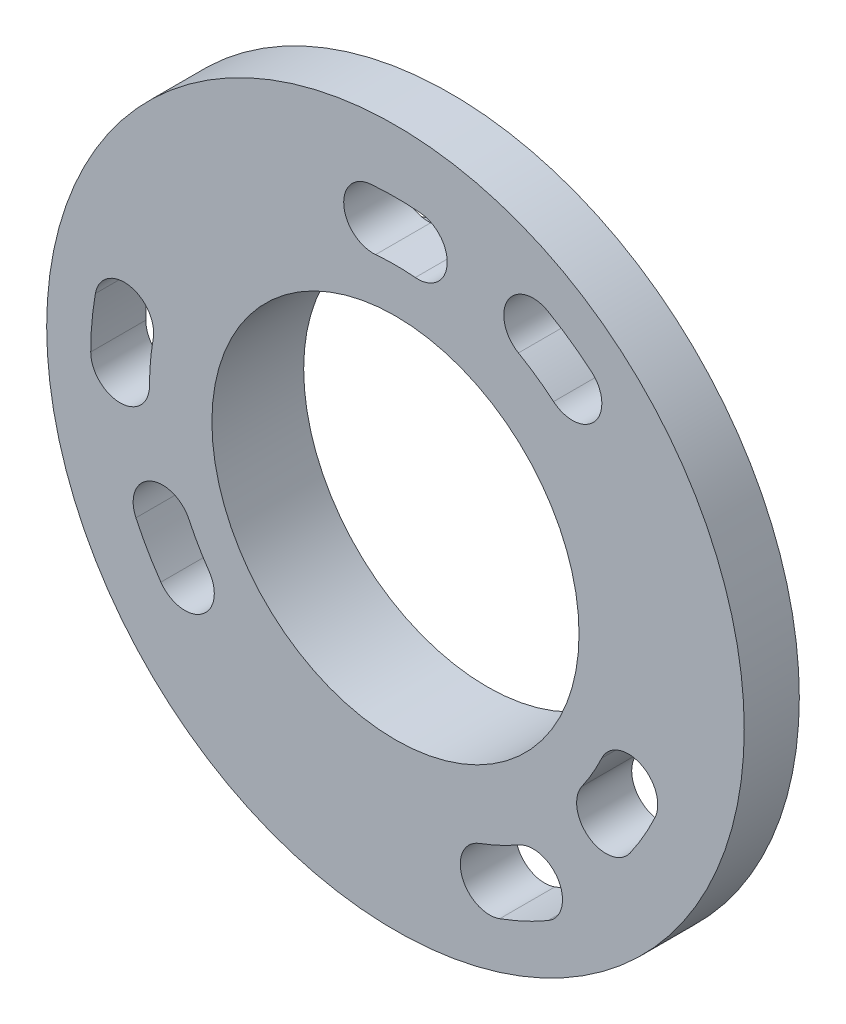
ISO-10303-21;
HEADER;
FILE_DESCRIPTION(('STEP AP214'),'2;1');
FILE_NAME('part.step','',(''),(''),'','','');
FILE_SCHEMA(('AUTOMOTIVE_DESIGN { 1 0 10303 214 1 1 1 1 }'));
ENDSEC;
DATA;
#1=APPLICATION_CONTEXT('core data for automotive mechanical design processes');
#2=APPLICATION_PROTOCOL_DEFINITION('international standard','automotive_design',2000,#1);
#3=PRODUCT_CONTEXT('',#1,'mechanical');
#4=PRODUCT('Part','Part','',(#3));
#5=PRODUCT_RELATED_PRODUCT_CATEGORY('part','',(#4));
#6=PRODUCT_DEFINITION_FORMATION('','',#4);
#7=PRODUCT_DEFINITION_CONTEXT('part definition',#1,'design');
#8=PRODUCT_DEFINITION('design','',#6,#7);
#9=PRODUCT_DEFINITION_SHAPE('','',#8);
#10=(LENGTH_UNIT() NAMED_UNIT(*) SI_UNIT(.MILLI.,.METRE.));
#11=(NAMED_UNIT(*) PLANE_ANGLE_UNIT() SI_UNIT($,.RADIAN.));
#12=(NAMED_UNIT(*) SI_UNIT($,.STERADIAN.) SOLID_ANGLE_UNIT());
#13=UNCERTAINTY_MEASURE_WITH_UNIT(LENGTH_MEASURE(1.E-05),#10,'distance_accuracy_value','');
#14=(GEOMETRIC_REPRESENTATION_CONTEXT(3) GLOBAL_UNCERTAINTY_ASSIGNED_CONTEXT((#13)) GLOBAL_UNIT_ASSIGNED_CONTEXT((#10,
#11,#12)) REPRESENTATION_CONTEXT('',''));
#15=CARTESIAN_POINT('',(0.,0.,0.));
#16=DIRECTION('',(0.,0.,1.));
#17=DIRECTION('',(1.,0.,0.));
#18=AXIS2_PLACEMENT_3D('',#15,#16,#17);
#19=CARTESIAN_POINT('',(0.,0.,0.));
#20=DIRECTION('',(0.,0.,1.));
#21=DIRECTION('',(1.,0.,0.));
#22=AXIS2_PLACEMENT_3D('',#19,#20,#21);
#23=PLANE('',#22);
#24=CARTESIAN_POINT('',(-14.7721162951831,2.60472266500391,0.));
#25=DIRECTION('',(0.,0.,1.));
#26=DIRECTION('',(1.,0.,0.));
#27=AXIS2_PLACEMENT_3D('',#24,#25,#26);
#28=CIRCLE('',#27,1.6);
#29=CARTESIAN_POINT('',(-13.1964238903636,2.32688558073683,0.));
#30=VERTEX_POINT('',#29);
#31=CARTESIAN_POINT('',(-16.3478087000027,2.88255974927099,0.));
#32=VERTEX_POINT('',#31);
#33=EDGE_CURVE('E69',#30,#32,#28,.T.);
#34=ORIENTED_EDGE('',*,*,#33,.T.);
#35=CARTESIAN_POINT('',(0.,0.,0.));
#36=DIRECTION('',(0.,0.,1.));
#37=DIRECTION('',(1.,0.,0.));
#38=AXIS2_PLACEMENT_3D('',#35,#36,#37);
#39=CIRCLE('',#38,16.6);
#40=CARTESIAN_POINT('',(-16.6,1.64214293123828E-13,0.));
#41=VERTEX_POINT('',#40);
#42=EDGE_CURVE('E223',#32,#41,#39,.T.);
#43=ORIENTED_EDGE('',*,*,#42,.T.);
#44=CARTESIAN_POINT('',(-15.,1.52655665885959E-13,0.));
#45=DIRECTION('',(0.,0.,1.));
#46=DIRECTION('',(1.,0.,0.));
#47=AXIS2_PLACEMENT_3D('',#44,#45,#46);
#48=CIRCLE('',#47,1.6);
#49=CARTESIAN_POINT('',(-13.4,1.52655665885959E-13,0.));
#50=VERTEX_POINT('',#49);
#51=EDGE_CURVE('E245',#41,#50,#48,.T.);
#52=ORIENTED_EDGE('',*,*,#51,.T.);
#53=CARTESIAN_POINT('',(0.,0.,0.));
#54=DIRECTION('',(0.,0.,-1.));
#55=DIRECTION('',(1.,0.,0.));
#56=AXIS2_PLACEMENT_3D('',#53,#54,#55);
#57=CIRCLE('',#56,13.4);
#58=EDGE_CURVE('E217',#50,#30,#57,.T.);
#59=ORIENTED_EDGE('',*,*,#58,.T.);
#60=EDGE_LOOP('',(#34,#43,#52,#59));
#61=FACE_BOUND('',#60,.T.);
#62=CARTESIAN_POINT('',(5.13030214988514,-14.0953893117886,0.));
#63=DIRECTION('',(0.,0.,1.));
#64=DIRECTION('',(1.,0.,0.));
#65=AXIS2_PLACEMENT_3D('',#62,#63,#64);
#66=CIRCLE('',#65,1.6);
#67=CARTESIAN_POINT('',(4.58306992056406,-12.5918811185311,0.));
#68=VERTEX_POINT('',#67);
#69=CARTESIAN_POINT('',(5.67753437920622,-15.598897505046,0.));
#70=VERTEX_POINT('',#69);
#71=EDGE_CURVE('E300',#68,#70,#66,.T.);
#72=ORIENTED_EDGE('',*,*,#71,.T.);
#73=CARTESIAN_POINT('',(0.,0.,0.));
#74=DIRECTION('',(0.,0.,1.));
#75=DIRECTION('',(1.,0.,0.));
#76=AXIS2_PLACEMENT_3D('',#73,#74,#75);
#77=CIRCLE('',#76,16.6);
#78=CARTESIAN_POINT('',(8.29999999999991,-14.3760217028217,0.));
#79=VERTEX_POINT('',#78);
#80=EDGE_CURVE('E319',#70,#79,#77,.T.);
#81=ORIENTED_EDGE('',*,*,#80,.T.);
#82=CARTESIAN_POINT('',(7.49999999999993,-12.9903810567666,0.));
#83=DIRECTION('',(0.,0.,1.));
#84=DIRECTION('',(1.,0.,0.));
#85=AXIS2_PLACEMENT_3D('',#82,#83,#84);
#86=CIRCLE('',#85,1.6);
#87=CARTESIAN_POINT('',(6.69999999999994,-11.6047404107115,0.));
#88=VERTEX_POINT('',#87);
#89=EDGE_CURVE('E323',#79,#88,#86,.T.);
#90=ORIENTED_EDGE('',*,*,#89,.T.);
#91=CARTESIAN_POINT('',(0.,0.,0.));
#92=DIRECTION('',(0.,0.,-1.));
#93=DIRECTION('',(1.,0.,0.));
#94=AXIS2_PLACEMENT_3D('',#91,#92,#93);
#95=CIRCLE('',#94,13.4);
#96=EDGE_CURVE('E305',#88,#68,#95,.T.);
#97=ORIENTED_EDGE('',*,*,#96,.T.);
#98=EDGE_LOOP('',(#72,#81,#90,#97));
#99=FACE_BOUND('',#98,.T.);
#100=CARTESIAN_POINT('',(9.64181414529794,11.4906666467848,0.));
#101=DIRECTION('',(0.,0.,1.));
#102=DIRECTION('',(1.,0.,0.));
#103=AXIS2_PLACEMENT_3D('',#100,#101,#102);
#104=CIRCLE('',#103,1.6);
#105=CARTESIAN_POINT('',(8.6133539697995,10.2649955377944,0.));
#106=VERTEX_POINT('',#105);
#107=CARTESIAN_POINT('',(10.6702743207964,12.7163377557752,0.));
#108=VERTEX_POINT('',#107);
#109=EDGE_CURVE('E386',#106,#108,#104,.T.);
#110=ORIENTED_EDGE('',*,*,#109,.T.);
#111=CARTESIAN_POINT('',(0.,0.,0.));
#112=DIRECTION('',(0.,0.,1.));
#113=DIRECTION('',(1.,0.,0.));
#114=AXIS2_PLACEMENT_3D('',#111,#112,#113);
#115=CIRCLE('',#114,16.6);
#116=CARTESIAN_POINT('',(8.30000000000001,14.3760217028217,0.));
#117=VERTEX_POINT('',#116);
#118=EDGE_CURVE('E405',#108,#117,#115,.T.);
#119=ORIENTED_EDGE('',*,*,#118,.T.);
#120=CARTESIAN_POINT('',(7.50000000000001,12.9903810567666,0.));
#121=DIRECTION('',(0.,0.,1.));
#122=DIRECTION('',(1.,0.,0.));
#123=AXIS2_PLACEMENT_3D('',#120,#121,#122);
#124=CIRCLE('',#123,1.6);
#125=CARTESIAN_POINT('',(6.70000000000001,11.6047404107115,0.));
#126=VERTEX_POINT('',#125);
#127=EDGE_CURVE('E409',#117,#126,#124,.T.);
#128=ORIENTED_EDGE('',*,*,#127,.T.);
#129=CARTESIAN_POINT('',(0.,0.,0.));
#130=DIRECTION('',(0.,0.,-1.));
#131=DIRECTION('',(1.,0.,0.));
#132=AXIS2_PLACEMENT_3D('',#129,#130,#131);
#133=CIRCLE('',#132,13.4);
#134=EDGE_CURVE('E391',#126,#106,#133,.T.);
#135=ORIENTED_EDGE('',*,*,#134,.T.);
#136=EDGE_LOOP('',(#110,#119,#128,#135));
#137=FACE_BOUND('',#136,.T.);
#138=CARTESIAN_POINT('',(0.,0.,0.));
#139=DIRECTION('',(0.,0.,1.));
#140=DIRECTION('',(1.,0.,0.));
#141=AXIS2_PLACEMENT_3D('',#138,#139,#140);
#142=CIRCLE('',#141,19.);
#143=CARTESIAN_POINT('',(19.,0.,0.));
#144=VERTEX_POINT('',#143);
#145=EDGE_CURVE('E476',#144,#144,#142,.T.);
#146=ORIENTED_EDGE('',*,*,#145,.F.);
#147=EDGE_LOOP('',(#146));
#148=FACE_BOUND('',#147,.T.);
#149=CARTESIAN_POINT('',(1.22018039846712,13.9467257732844,0.));
#150=DIRECTION('',(0.,0.,1.));
#151=DIRECTION('',(1.,0.,0.));
#152=AXIS2_PLACEMENT_3D('',#149,#150,#151);
#153=CIRCLE('',#152,1.6);
#154=CARTESIAN_POINT('',(1.08073121007088,12.3528142563377,0.));
#155=VERTEX_POINT('',#154);
#156=CARTESIAN_POINT('',(1.35962958686336,15.5406372902312,0.));
#157=VERTEX_POINT('',#156);
#158=EDGE_CURVE('E429',#155,#157,#153,.T.);
#159=ORIENTED_EDGE('',*,*,#158,.T.);
#160=CARTESIAN_POINT('',(0.,0.,0.));
#161=DIRECTION('',(0.,0.,1.));
#162=DIRECTION('',(1.,0.,0.));
#163=AXIS2_PLACEMENT_3D('',#160,#161,#162);
#164=CIRCLE('',#163,15.6);
#165=CARTESIAN_POINT('',(-1.35962958686347,15.5406372902312,0.));
#166=VERTEX_POINT('',#165);
#167=EDGE_CURVE('E448',#157,#166,#164,.T.);
#168=ORIENTED_EDGE('',*,*,#167,.T.);
#169=CARTESIAN_POINT('',(-1.22018039846722,13.9467257732844,0.));
#170=DIRECTION('',(0.,0.,1.));
#171=DIRECTION('',(1.,0.,0.));
#172=AXIS2_PLACEMENT_3D('',#169,#170,#171);
#173=CIRCLE('',#172,1.6);
#174=CARTESIAN_POINT('',(-1.08073121007096,12.3528142563376,0.));
#175=VERTEX_POINT('',#174);
#176=EDGE_CURVE('E452',#166,#175,#173,.T.);
#177=ORIENTED_EDGE('',*,*,#176,.T.);
#178=CARTESIAN_POINT('',(0.,0.,0.));
#179=DIRECTION('',(0.,0.,-1.));
#180=DIRECTION('',(1.,0.,0.));
#181=AXIS2_PLACEMENT_3D('',#178,#179,#180);
#182=CIRCLE('',#181,12.4);
#183=EDGE_CURVE('E434',#175,#155,#182,.T.);
#184=ORIENTED_EDGE('',*,*,#183,.T.);
#185=EDGE_LOOP('',(#159,#168,#177,#184));
#186=FACE_BOUND('',#185,.T.);
#187=CARTESIAN_POINT('',(11.4681286200459,-8.03007010891462,0.));
#188=DIRECTION('',(0.,0.,1.));
#189=DIRECTION('',(1.,0.,0.));
#190=AXIS2_PLACEMENT_3D('',#187,#188,#189);
#191=CIRCLE('',#190,1.6);
#192=CARTESIAN_POINT('',(10.1574853491835,-7.11234781075295,0.));
#193=VERTEX_POINT('',#192);
#194=CARTESIAN_POINT('',(12.7787718909083,-8.94779240707629,0.));
#195=VERTEX_POINT('',#194);
#196=EDGE_CURVE('E343',#193,#195,#191,.T.);
#197=ORIENTED_EDGE('',*,*,#196,.T.);
#198=CARTESIAN_POINT('',(0.,0.,0.));
#199=DIRECTION('',(0.,0.,1.));
#200=DIRECTION('',(1.,0.,0.));
#201=AXIS2_PLACEMENT_3D('',#198,#199,#200);
#202=CIRCLE('',#201,15.6);
#203=CARTESIAN_POINT('',(14.1384014777717,-6.59284488315499,0.));
#204=VERTEX_POINT('',#203);
#205=EDGE_CURVE('E362',#195,#204,#202,.T.);
#206=ORIENTED_EDGE('',*,*,#205,.T.);
#207=CARTESIAN_POINT('',(12.6883090185131,-5.91665566436985,0.));
#208=DIRECTION('',(0.,0.,1.));
#209=DIRECTION('',(1.,0.,0.));
#210=AXIS2_PLACEMENT_3D('',#207,#208,#209);
#211=CIRCLE('',#210,1.6);
#212=CARTESIAN_POINT('',(11.2382165592544,-5.24046644558472,0.));
#213=VERTEX_POINT('',#212);
#214=EDGE_CURVE('E366',#204,#213,#211,.T.);
#215=ORIENTED_EDGE('',*,*,#214,.T.);
#216=CARTESIAN_POINT('',(0.,0.,0.));
#217=DIRECTION('',(0.,0.,-1.));
#218=DIRECTION('',(1.,0.,0.));
#219=AXIS2_PLACEMENT_3D('',#216,#217,#218);
#220=CIRCLE('',#219,12.4);
#221=EDGE_CURVE('E348',#213,#193,#220,.T.);
#222=ORIENTED_EDGE('',*,*,#221,.T.);
#223=EDGE_LOOP('',(#197,#206,#215,#222));
#224=FACE_BOUND('',#223,.T.);
#225=CARTESIAN_POINT('',(-12.6883090185131,-5.91665566436976,0.));
#226=DIRECTION('',(0.,0.,1.));
#227=DIRECTION('',(1.,0.,0.));
#228=AXIS2_PLACEMENT_3D('',#225,#226,#227);
#229=CIRCLE('',#228,1.6);
#230=CARTESIAN_POINT('',(-11.2382165592545,-5.24046644558464,0.));
#231=VERTEX_POINT('',#230);
#232=CARTESIAN_POINT('',(-14.1384014777718,-6.59284488315487,0.));
#233=VERTEX_POINT('',#232);
#234=EDGE_CURVE('E225',#231,#233,#229,.T.);
#235=ORIENTED_EDGE('',*,*,#234,.T.);
#236=CARTESIAN_POINT('',(0.,0.,0.));
#237=DIRECTION('',(0.,0.,1.));
#238=DIRECTION('',(1.,0.,0.));
#239=AXIS2_PLACEMENT_3D('',#236,#237,#238);
#240=CIRCLE('',#239,15.6);
#241=CARTESIAN_POINT('',(-12.7787718909084,-8.9477924070762,0.));
#242=VERTEX_POINT('',#241);
#243=EDGE_CURVE('E276',#233,#242,#240,.T.);
#244=ORIENTED_EDGE('',*,*,#243,.T.);
#245=CARTESIAN_POINT('',(-11.468128620046,-8.03007010891454,0.));
#246=DIRECTION('',(0.,0.,1.));
#247=DIRECTION('',(1.,0.,0.));
#248=AXIS2_PLACEMENT_3D('',#245,#246,#247);
#249=CIRCLE('',#248,1.6);
#250=CARTESIAN_POINT('',(-10.1574853491836,-7.11234781075288,0.));
#251=VERTEX_POINT('',#250);
#252=EDGE_CURVE('E280',#242,#251,#249,.T.);
#253=ORIENTED_EDGE('',*,*,#252,.T.);
#254=CARTESIAN_POINT('',(0.,0.,0.));
#255=DIRECTION('',(0.,0.,-1.));
#256=DIRECTION('',(1.,0.,0.));
#257=AXIS2_PLACEMENT_3D('',#254,#255,#256);
#258=CIRCLE('',#257,12.4);
#259=EDGE_CURVE('E262',#251,#231,#258,.T.);
#260=ORIENTED_EDGE('',*,*,#259,.T.);
#261=EDGE_LOOP('',(#235,#244,#253,#260));
#262=FACE_BOUND('',#261,.T.);
#263=CARTESIAN_POINT('',(0.,0.,0.));
#264=DIRECTION('',(0.,0.,1.));
#265=DIRECTION('',(1.,0.,0.));
#266=AXIS2_PLACEMENT_3D('',#263,#264,#265);
#267=CIRCLE('',#266,11.);
#268=CARTESIAN_POINT('',(11.,0.,0.));
#269=VERTEX_POINT('',#268);
#270=EDGE_CURVE('E11',#269,#269,#267,.F.);
#271=ORIENTED_EDGE('',*,*,#270,.F.);
#272=EDGE_LOOP('',(#271));
#273=FACE_BOUND('',#272,.T.);
#274=ADVANCED_FACE('F45',(#61,#99,#137,#148,#186,#224,#262,#273),#23,.F.);
#275=CARTESIAN_POINT('',(0.,0.,3.));
#276=DIRECTION('',(0.,0.,1.));
#277=DIRECTION('',(1.,0.,0.));
#278=AXIS2_PLACEMENT_3D('',#275,#276,#277);
#279=PLANE('',#278);
#280=CARTESIAN_POINT('',(0.,0.,3.));
#281=DIRECTION('',(0.,0.,1.));
#282=DIRECTION('',(1.,0.,0.));
#283=AXIS2_PLACEMENT_3D('',#280,#281,#282);
#284=CIRCLE('',#283,19.);
#285=CARTESIAN_POINT('',(19.,0.,3.));
#286=VERTEX_POINT('',#285);
#287=EDGE_CURVE('E54',#286,#286,#284,.T.);
#288=ORIENTED_EDGE('',*,*,#287,.T.);
#289=EDGE_LOOP('',(#288));
#290=FACE_BOUND('',#289,.T.);
#291=CARTESIAN_POINT('',(0.,0.,3.));
#292=DIRECTION('',(0.,0.,1.));
#293=DIRECTION('',(1.,0.,0.));
#294=AXIS2_PLACEMENT_3D('',#291,#292,#293);
#295=CIRCLE('',#294,10.);
#296=CARTESIAN_POINT('',(10.,0.,3.));
#297=VERTEX_POINT('',#296);
#298=EDGE_CURVE('E472',#297,#297,#295,.T.);
#299=ORIENTED_EDGE('',*,*,#298,.F.);
#300=EDGE_LOOP('',(#299));
#301=FACE_BOUND('',#300,.T.);
#302=CARTESIAN_POINT('',(0.,0.,3.));
#303=DIRECTION('',(0.,0.,1.));
#304=DIRECTION('',(1.,0.,0.));
#305=AXIS2_PLACEMENT_3D('',#302,#303,#304);
#306=CIRCLE('',#305,15.6);
#307=CARTESIAN_POINT('',(1.35962958686336,15.5406372902312,3.));
#308=VERTEX_POINT('',#307);
#309=CARTESIAN_POINT('',(-1.35962958686347,15.5406372902312,3.));
#310=VERTEX_POINT('',#309);
#311=EDGE_CURVE('E433',#308,#310,#306,.T.);
#312=ORIENTED_EDGE('',*,*,#311,.F.);
#313=CARTESIAN_POINT('',(1.22018039846712,13.9467257732844,3.));
#314=DIRECTION('',(0.,0.,1.));
#315=DIRECTION('',(1.,0.,0.));
#316=AXIS2_PLACEMENT_3D('',#313,#314,#315);
#317=CIRCLE('',#316,1.6);
#318=CARTESIAN_POINT('',(1.08073121007088,12.3528142563377,3.));
#319=VERTEX_POINT('',#318);
#320=EDGE_CURVE('E430',#319,#308,#317,.T.);
#321=ORIENTED_EDGE('',*,*,#320,.F.);
#322=CARTESIAN_POINT('',(0.,0.,3.));
#323=DIRECTION('',(0.,0.,-1.));
#324=DIRECTION('',(1.,0.,0.));
#325=AXIS2_PLACEMENT_3D('',#322,#323,#324);
#326=CIRCLE('',#325,12.4);
#327=CARTESIAN_POINT('',(-1.08073121007096,12.3528142563376,3.));
#328=VERTEX_POINT('',#327);
#329=EDGE_CURVE('E441',#328,#319,#326,.T.);
#330=ORIENTED_EDGE('',*,*,#329,.F.);
#331=CARTESIAN_POINT('',(-1.22018039846722,13.9467257732844,3.));
#332=DIRECTION('',(0.,0.,1.));
#333=DIRECTION('',(1.,0.,0.));
#334=AXIS2_PLACEMENT_3D('',#331,#332,#333);
#335=CIRCLE('',#334,1.6);
#336=EDGE_CURVE('E437',#310,#328,#335,.T.);
#337=ORIENTED_EDGE('',*,*,#336,.F.);
#338=EDGE_LOOP('',(#312,#321,#330,#337));
#339=FACE_BOUND('',#338,.T.);
#340=CARTESIAN_POINT('',(0.,0.,3.));
#341=DIRECTION('',(0.,0.,1.));
#342=DIRECTION('',(1.,0.,0.));
#343=AXIS2_PLACEMENT_3D('',#340,#341,#342);
#344=CIRCLE('',#343,16.6);
#345=CARTESIAN_POINT('',(10.6702743207964,12.7163377557752,3.));
#346=VERTEX_POINT('',#345);
#347=CARTESIAN_POINT('',(8.30000000000001,14.3760217028217,3.));
#348=VERTEX_POINT('',#347);
#349=EDGE_CURVE('E390',#346,#348,#344,.T.);
#350=ORIENTED_EDGE('',*,*,#349,.F.);
#351=CARTESIAN_POINT('',(9.64181414529794,11.4906666467848,3.));
#352=DIRECTION('',(0.,0.,1.));
#353=DIRECTION('',(1.,0.,0.));
#354=AXIS2_PLACEMENT_3D('',#351,#352,#353);
#355=CIRCLE('',#354,1.6);
#356=CARTESIAN_POINT('',(8.6133539697995,10.2649955377944,3.));
#357=VERTEX_POINT('',#356);
#358=EDGE_CURVE('E387',#357,#346,#355,.T.);
#359=ORIENTED_EDGE('',*,*,#358,.F.);
#360=CARTESIAN_POINT('',(0.,0.,3.));
#361=DIRECTION('',(0.,0.,-1.));
#362=DIRECTION('',(1.,0.,0.));
#363=AXIS2_PLACEMENT_3D('',#360,#361,#362);
#364=CIRCLE('',#363,13.4);
#365=CARTESIAN_POINT('',(6.70000000000001,11.6047404107115,3.));
#366=VERTEX_POINT('',#365);
#367=EDGE_CURVE('E398',#366,#357,#364,.T.);
#368=ORIENTED_EDGE('',*,*,#367,.F.);
#369=CARTESIAN_POINT('',(7.50000000000001,12.9903810567666,3.));
#370=DIRECTION('',(0.,0.,1.));
#371=DIRECTION('',(1.,0.,0.));
#372=AXIS2_PLACEMENT_3D('',#369,#370,#371);
#373=CIRCLE('',#372,1.6);
#374=EDGE_CURVE('E394',#348,#366,#373,.T.);
#375=ORIENTED_EDGE('',*,*,#374,.F.);
#376=EDGE_LOOP('',(#350,#359,#368,#375));
#377=FACE_BOUND('',#376,.T.);
#378=CARTESIAN_POINT('',(0.,0.,3.));
#379=DIRECTION('',(0.,0.,1.));
#380=DIRECTION('',(1.,0.,0.));
#381=AXIS2_PLACEMENT_3D('',#378,#379,#380);
#382=CIRCLE('',#381,15.6);
#383=CARTESIAN_POINT('',(12.7787718909083,-8.94779240707629,3.));
#384=VERTEX_POINT('',#383);
#385=CARTESIAN_POINT('',(14.1384014777717,-6.59284488315499,3.));
#386=VERTEX_POINT('',#385);
#387=EDGE_CURVE('E347',#384,#386,#382,.T.);
#388=ORIENTED_EDGE('',*,*,#387,.F.);
#389=CARTESIAN_POINT('',(11.4681286200459,-8.03007010891462,3.));
#390=DIRECTION('',(0.,0.,1.));
#391=DIRECTION('',(1.,0.,0.));
#392=AXIS2_PLACEMENT_3D('',#389,#390,#391);
#393=CIRCLE('',#392,1.6);
#394=CARTESIAN_POINT('',(10.1574853491835,-7.11234781075295,3.));
#395=VERTEX_POINT('',#394);
#396=EDGE_CURVE('E344',#395,#384,#393,.T.);
#397=ORIENTED_EDGE('',*,*,#396,.F.);
#398=CARTESIAN_POINT('',(0.,0.,3.));
#399=DIRECTION('',(0.,0.,-1.));
#400=DIRECTION('',(1.,0.,0.));
#401=AXIS2_PLACEMENT_3D('',#398,#399,#400);
#402=CIRCLE('',#401,12.4);
#403=CARTESIAN_POINT('',(11.2382165592544,-5.24046644558472,3.));
#404=VERTEX_POINT('',#403);
#405=EDGE_CURVE('E355',#404,#395,#402,.T.);
#406=ORIENTED_EDGE('',*,*,#405,.F.);
#407=CARTESIAN_POINT('',(12.6883090185131,-5.91665566436985,3.));
#408=DIRECTION('',(0.,0.,1.));
#409=DIRECTION('',(1.,0.,0.));
#410=AXIS2_PLACEMENT_3D('',#407,#408,#409);
#411=CIRCLE('',#410,1.6);
#412=EDGE_CURVE('E351',#386,#404,#411,.T.);
#413=ORIENTED_EDGE('',*,*,#412,.F.);
#414=EDGE_LOOP('',(#388,#397,#406,#413));
#415=FACE_BOUND('',#414,.T.);
#416=CARTESIAN_POINT('',(0.,0.,3.));
#417=DIRECTION('',(0.,0.,1.));
#418=DIRECTION('',(1.,0.,0.));
#419=AXIS2_PLACEMENT_3D('',#416,#417,#418);
#420=CIRCLE('',#419,16.6);
#421=CARTESIAN_POINT('',(5.67753437920622,-15.598897505046,3.));
#422=VERTEX_POINT('',#421);
#423=CARTESIAN_POINT('',(8.29999999999991,-14.3760217028217,3.));
#424=VERTEX_POINT('',#423);
#425=EDGE_CURVE('E304',#422,#424,#420,.T.);
#426=ORIENTED_EDGE('',*,*,#425,.F.);
#427=CARTESIAN_POINT('',(5.13030214988514,-14.0953893117886,3.));
#428=DIRECTION('',(0.,0.,1.));
#429=DIRECTION('',(1.,0.,0.));
#430=AXIS2_PLACEMENT_3D('',#427,#428,#429);
#431=CIRCLE('',#430,1.6);
#432=CARTESIAN_POINT('',(4.58306992056406,-12.5918811185311,3.));
#433=VERTEX_POINT('',#432);
#434=EDGE_CURVE('E301',#433,#422,#431,.T.);
#435=ORIENTED_EDGE('',*,*,#434,.F.);
#436=CARTESIAN_POINT('',(0.,0.,3.));
#437=DIRECTION('',(0.,0.,-1.));
#438=DIRECTION('',(1.,0.,0.));
#439=AXIS2_PLACEMENT_3D('',#436,#437,#438);
#440=CIRCLE('',#439,13.4);
#441=CARTESIAN_POINT('',(6.69999999999994,-11.6047404107115,3.));
#442=VERTEX_POINT('',#441);
#443=EDGE_CURVE('E312',#442,#433,#440,.T.);
#444=ORIENTED_EDGE('',*,*,#443,.F.);
#445=CARTESIAN_POINT('',(7.49999999999993,-12.9903810567666,3.));
#446=DIRECTION('',(0.,0.,1.));
#447=DIRECTION('',(1.,0.,0.));
#448=AXIS2_PLACEMENT_3D('',#445,#446,#447);
#449=CIRCLE('',#448,1.6);
#450=EDGE_CURVE('E308',#424,#442,#449,.T.);
#451=ORIENTED_EDGE('',*,*,#450,.F.);
#452=EDGE_LOOP('',(#426,#435,#444,#451));
#453=FACE_BOUND('',#452,.T.);
#454=CARTESIAN_POINT('',(0.,0.,3.));
#455=DIRECTION('',(0.,0.,1.));
#456=DIRECTION('',(1.,0.,0.));
#457=AXIS2_PLACEMENT_3D('',#454,#455,#456);
#458=CIRCLE('',#457,15.6);
#459=CARTESIAN_POINT('',(-14.1384014777718,-6.59284488315487,3.));
#460=VERTEX_POINT('',#459);
#461=CARTESIAN_POINT('',(-12.7787718909084,-8.9477924070762,3.));
#462=VERTEX_POINT('',#461);
#463=EDGE_CURVE('E261',#460,#462,#458,.T.);
#464=ORIENTED_EDGE('',*,*,#463,.F.);
#465=CARTESIAN_POINT('',(-12.6883090185131,-5.91665566436976,3.));
#466=DIRECTION('',(0.,0.,1.));
#467=DIRECTION('',(1.,0.,0.));
#468=AXIS2_PLACEMENT_3D('',#465,#466,#467);
#469=CIRCLE('',#468,1.6);
#470=CARTESIAN_POINT('',(-11.2382165592545,-5.24046644558464,3.));
#471=VERTEX_POINT('',#470);
#472=EDGE_CURVE('E258',#471,#460,#469,.T.);
#473=ORIENTED_EDGE('',*,*,#472,.F.);
#474=CARTESIAN_POINT('',(0.,0.,3.));
#475=DIRECTION('',(0.,0.,-1.));
#476=DIRECTION('',(1.,0.,0.));
#477=AXIS2_PLACEMENT_3D('',#474,#475,#476);
#478=CIRCLE('',#477,12.4);
#479=CARTESIAN_POINT('',(-10.1574853491836,-7.11234781075288,3.));
#480=VERTEX_POINT('',#479);
#481=EDGE_CURVE('E269',#480,#471,#478,.T.);
#482=ORIENTED_EDGE('',*,*,#481,.F.);
#483=CARTESIAN_POINT('',(-11.468128620046,-8.03007010891454,3.));
#484=DIRECTION('',(0.,0.,1.));
#485=DIRECTION('',(1.,0.,0.));
#486=AXIS2_PLACEMENT_3D('',#483,#484,#485);
#487=CIRCLE('',#486,1.6);
#488=EDGE_CURVE('E265',#462,#480,#487,.T.);
#489=ORIENTED_EDGE('',*,*,#488,.F.);
#490=EDGE_LOOP('',(#464,#473,#482,#489));
#491=FACE_BOUND('',#490,.T.);
#492=CARTESIAN_POINT('',(0.,0.,3.));
#493=DIRECTION('',(0.,0.,1.));
#494=DIRECTION('',(1.,0.,0.));
#495=AXIS2_PLACEMENT_3D('',#492,#493,#494);
#496=CIRCLE('',#495,16.6);
#497=CARTESIAN_POINT('',(-16.3478087000027,2.88255974927099,3.));
#498=VERTEX_POINT('',#497);
#499=CARTESIAN_POINT('',(-16.6,1.64214293123828E-13,3.));
#500=VERTEX_POINT('',#499);
#501=EDGE_CURVE('E216',#498,#500,#496,.T.);
#502=ORIENTED_EDGE('',*,*,#501,.F.);
#503=CARTESIAN_POINT('',(-14.7721162951831,2.60472266500391,3.));
#504=DIRECTION('',(0.,0.,1.));
#505=DIRECTION('',(1.,0.,0.));
#506=AXIS2_PLACEMENT_3D('',#503,#504,#505);
#507=CIRCLE('',#506,1.6);
#508=CARTESIAN_POINT('',(-13.1964238903636,2.32688558073683,3.));
#509=VERTEX_POINT('',#508);
#510=EDGE_CURVE('E207',#509,#498,#507,.T.);
#511=ORIENTED_EDGE('',*,*,#510,.F.);
#512=CARTESIAN_POINT('',(0.,0.,3.));
#513=DIRECTION('',(0.,0.,-1.));
#514=DIRECTION('',(1.,0.,0.));
#515=AXIS2_PLACEMENT_3D('',#512,#513,#514);
#516=CIRCLE('',#515,13.4);
#517=CARTESIAN_POINT('',(-13.4,1.52655665885959E-13,3.));
#518=VERTEX_POINT('',#517);
#519=EDGE_CURVE('E234',#518,#509,#516,.T.);
#520=ORIENTED_EDGE('',*,*,#519,.F.);
#521=CARTESIAN_POINT('',(-15.,1.52655665885959E-13,3.));
#522=DIRECTION('',(0.,0.,1.));
#523=DIRECTION('',(1.,0.,0.));
#524=AXIS2_PLACEMENT_3D('',#521,#522,#523);
#525=CIRCLE('',#524,1.6);
#526=EDGE_CURVE('E230',#500,#518,#525,.T.);
#527=ORIENTED_EDGE('',*,*,#526,.F.);
#528=EDGE_LOOP('',(#502,#511,#520,#527));
#529=FACE_BOUND('',#528,.T.);
#530=ADVANCED_FACE('F229',(#290,#301,#339,#377,#415,#453,#491,#529),#279,.T.);
#531=CARTESIAN_POINT('',(0.,0.,3.));
#532=DIRECTION('',(0.,0.,-1.));
#533=DIRECTION('',(-1.,0.,0.));
#534=AXIS2_PLACEMENT_3D('',#531,#532,#533);
#535=CYLINDRICAL_SURFACE('',#534,19.);
#536=ORIENTED_EDGE('',*,*,#287,.F.);
#537=EDGE_LOOP('',(#536));
#538=FACE_BOUND('',#537,.T.);
#539=ORIENTED_EDGE('',*,*,#145,.T.);
#540=EDGE_LOOP('',(#539));
#541=FACE_BOUND('',#540,.T.);
#542=ADVANCED_FACE('F47',(#538,#541),#535,.T.);
#543=CARTESIAN_POINT('',(0.,0.,3.));
#544=DIRECTION('',(0.,0.,-1.));
#545=DIRECTION('',(-1.,0.,0.));
#546=AXIS2_PLACEMENT_3D('',#543,#544,#545);
#547=CYLINDRICAL_SURFACE('',#546,10.);
#548=ORIENTED_EDGE('',*,*,#298,.T.);
#549=EDGE_LOOP('',(#548));
#550=FACE_BOUND('',#549,.T.);
#551=CARTESIAN_POINT('',(0.,0.,-2.));
#552=DIRECTION('',(0.,0.,-1.));
#553=DIRECTION('',(-1.,0.,0.));
#554=AXIS2_PLACEMENT_3D('',#551,#552,#553);
#555=CIRCLE('',#554,10.);
#556=CARTESIAN_POINT('',(-10.,0.,-2.));
#557=VERTEX_POINT('',#556);
#558=EDGE_CURVE('E663',#557,#557,#555,.T.);
#559=ORIENTED_EDGE('',*,*,#558,.T.);
#560=EDGE_LOOP('',(#559));
#561=FACE_BOUND('',#560,.T.);
#562=ADVANCED_FACE('F594',(#550,#561),#547,.F.);
#563=CARTESIAN_POINT('',(1.22018039846712,13.9467257732844,3.));
#564=DIRECTION('',(0.,0.,-1.));
#565=DIRECTION('',(-1.,0.,0.));
#566=AXIS2_PLACEMENT_3D('',#563,#564,#565);
#567=CYLINDRICAL_SURFACE('',#566,1.6);
#568=ORIENTED_EDGE('',*,*,#158,.F.);
#569=DIRECTION('',(0.,0.,-1.));
#570=VECTOR('',#569,1.);
#571=CARTESIAN_POINT('',(1.08073121007088,12.3528142563377,3.));
#572=LINE('',#571,#570);
#573=EDGE_CURVE('E444',#319,#155,#572,.T.);
#574=ORIENTED_EDGE('',*,*,#573,.F.);
#575=ORIENTED_EDGE('',*,*,#320,.T.);
#576=DIRECTION('',(0.,0.,-1.));
#577=VECTOR('',#576,1.);
#578=CARTESIAN_POINT('',(1.35962958686336,15.5406372902312,3.));
#579=LINE('',#578,#577);
#580=EDGE_CURVE('E468',#308,#157,#579,.T.);
#581=ORIENTED_EDGE('',*,*,#580,.T.);
#582=EDGE_LOOP('',(#568,#574,#575,#581));
#583=FACE_BOUND('',#582,.T.);
#584=ADVANCED_FACE('F590',(#583),#567,.F.);
#585=CARTESIAN_POINT('',(0.,0.,3.));
#586=DIRECTION('',(0.,0.,-1.));
#587=DIRECTION('',(-1.,0.,0.));
#588=AXIS2_PLACEMENT_3D('',#585,#586,#587);
#589=CYLINDRICAL_SURFACE('',#588,15.6);
#590=ORIENTED_EDGE('',*,*,#167,.F.);
#591=ORIENTED_EDGE('',*,*,#580,.F.);
#592=ORIENTED_EDGE('',*,*,#311,.T.);
#593=DIRECTION('',(0.,0.,-1.));
#594=VECTOR('',#593,1.);
#595=CARTESIAN_POINT('',(-1.35962958686347,15.5406372902312,3.));
#596=LINE('',#595,#594);
#597=EDGE_CURVE('E465',#310,#166,#596,.T.);
#598=ORIENTED_EDGE('',*,*,#597,.T.);
#599=EDGE_LOOP('',(#590,#591,#592,#598));
#600=FACE_BOUND('',#599,.T.);
#601=ADVANCED_FACE('F586',(#600),#589,.F.);
#602=CARTESIAN_POINT('',(-1.22018039846722,13.9467257732844,3.));
#603=DIRECTION('',(0.,0.,-1.));
#604=DIRECTION('',(-1.,0.,0.));
#605=AXIS2_PLACEMENT_3D('',#602,#603,#604);
#606=CYLINDRICAL_SURFACE('',#605,1.6);
#607=ORIENTED_EDGE('',*,*,#176,.F.);
#608=ORIENTED_EDGE('',*,*,#597,.F.);
#609=ORIENTED_EDGE('',*,*,#336,.T.);
#610=DIRECTION('',(0.,0.,-1.));
#611=VECTOR('',#610,1.);
#612=CARTESIAN_POINT('',(-1.08073121007096,12.3528142563376,3.));
#613=LINE('',#612,#611);
#614=EDGE_CURVE('E462',#328,#175,#613,.T.);
#615=ORIENTED_EDGE('',*,*,#614,.T.);
#616=EDGE_LOOP('',(#607,#608,#609,#615));
#617=FACE_BOUND('',#616,.T.);
#618=ADVANCED_FACE('F582',(#617),#606,.F.);
#619=CARTESIAN_POINT('',(0.,0.,3.));
#620=DIRECTION('',(0.,0.,-1.));
#621=DIRECTION('',(-1.,0.,0.));
#622=AXIS2_PLACEMENT_3D('',#619,#620,#621);
#623=CYLINDRICAL_SURFACE('',#622,12.4);
#624=ORIENTED_EDGE('',*,*,#183,.F.);
#625=ORIENTED_EDGE('',*,*,#614,.F.);
#626=ORIENTED_EDGE('',*,*,#329,.T.);
#627=ORIENTED_EDGE('',*,*,#573,.T.);
#628=EDGE_LOOP('',(#624,#625,#626,#627));
#629=FACE_BOUND('',#628,.T.);
#630=ADVANCED_FACE('F578',(#629),#623,.T.);
#631=CARTESIAN_POINT('',(9.64181414529794,11.4906666467848,3.));
#632=DIRECTION('',(0.,0.,-1.));
#633=DIRECTION('',(-1.,0.,0.));
#634=AXIS2_PLACEMENT_3D('',#631,#632,#633);
#635=CYLINDRICAL_SURFACE('',#634,1.6);
#636=ORIENTED_EDGE('',*,*,#109,.F.);
#637=DIRECTION('',(0.,0.,-1.));
#638=VECTOR('',#637,1.);
#639=CARTESIAN_POINT('',(8.6133539697995,10.2649955377944,3.));
#640=LINE('',#639,#638);
#641=EDGE_CURVE('E401',#357,#106,#640,.T.);
#642=ORIENTED_EDGE('',*,*,#641,.F.);
#643=ORIENTED_EDGE('',*,*,#358,.T.);
#644=DIRECTION('',(0.,0.,-1.));
#645=VECTOR('',#644,1.);
#646=CARTESIAN_POINT('',(10.6702743207964,12.7163377557752,3.));
#647=LINE('',#646,#645);
#648=EDGE_CURVE('E425',#346,#108,#647,.T.);
#649=ORIENTED_EDGE('',*,*,#648,.T.);
#650=EDGE_LOOP('',(#636,#642,#643,#649));
#651=FACE_BOUND('',#650,.T.);
#652=ADVANCED_FACE('F574',(#651),#635,.F.);
#653=CARTESIAN_POINT('',(0.,0.,3.));
#654=DIRECTION('',(0.,0.,-1.));
#655=DIRECTION('',(-1.,0.,0.));
#656=AXIS2_PLACEMENT_3D('',#653,#654,#655);
#657=CYLINDRICAL_SURFACE('',#656,16.6);
#658=ORIENTED_EDGE('',*,*,#118,.F.);
#659=ORIENTED_EDGE('',*,*,#648,.F.);
#660=ORIENTED_EDGE('',*,*,#349,.T.);
#661=DIRECTION('',(0.,0.,-1.));
#662=VECTOR('',#661,1.);
#663=CARTESIAN_POINT('',(8.30000000000001,14.3760217028217,3.));
#664=LINE('',#663,#662);
#665=EDGE_CURVE('E422',#348,#117,#664,.T.);
#666=ORIENTED_EDGE('',*,*,#665,.T.);
#667=EDGE_LOOP('',(#658,#659,#660,#666));
#668=FACE_BOUND('',#667,.T.);
#669=ADVANCED_FACE('F570',(#668),#657,.F.);
#670=CARTESIAN_POINT('',(7.50000000000001,12.9903810567666,3.));
#671=DIRECTION('',(0.,0.,-1.));
#672=DIRECTION('',(-1.,0.,0.));
#673=AXIS2_PLACEMENT_3D('',#670,#671,#672);
#674=CYLINDRICAL_SURFACE('',#673,1.6);
#675=ORIENTED_EDGE('',*,*,#127,.F.);
#676=ORIENTED_EDGE('',*,*,#665,.F.);
#677=ORIENTED_EDGE('',*,*,#374,.T.);
#678=DIRECTION('',(0.,0.,-1.));
#679=VECTOR('',#678,1.);
#680=CARTESIAN_POINT('',(6.70000000000001,11.6047404107115,3.));
#681=LINE('',#680,#679);
#682=EDGE_CURVE('E419',#366,#126,#681,.T.);
#683=ORIENTED_EDGE('',*,*,#682,.T.);
#684=EDGE_LOOP('',(#675,#676,#677,#683));
#685=FACE_BOUND('',#684,.T.);
#686=ADVANCED_FACE('F566',(#685),#674,.F.);
#687=CARTESIAN_POINT('',(0.,0.,3.));
#688=DIRECTION('',(0.,0.,-1.));
#689=DIRECTION('',(-1.,0.,0.));
#690=AXIS2_PLACEMENT_3D('',#687,#688,#689);
#691=CYLINDRICAL_SURFACE('',#690,13.4);
#692=ORIENTED_EDGE('',*,*,#134,.F.);
#693=ORIENTED_EDGE('',*,*,#682,.F.);
#694=ORIENTED_EDGE('',*,*,#367,.T.);
#695=ORIENTED_EDGE('',*,*,#641,.T.);
#696=EDGE_LOOP('',(#692,#693,#694,#695));
#697=FACE_BOUND('',#696,.T.);
#698=ADVANCED_FACE('F562',(#697),#691,.T.);
#699=CARTESIAN_POINT('',(11.4681286200459,-8.03007010891462,3.));
#700=DIRECTION('',(0.,0.,-1.));
#701=DIRECTION('',(-1.,0.,0.));
#702=AXIS2_PLACEMENT_3D('',#699,#700,#701);
#703=CYLINDRICAL_SURFACE('',#702,1.6);
#704=ORIENTED_EDGE('',*,*,#196,.F.);
#705=DIRECTION('',(0.,0.,-1.));
#706=VECTOR('',#705,1.);
#707=CARTESIAN_POINT('',(10.1574853491835,-7.11234781075295,3.));
#708=LINE('',#707,#706);
#709=EDGE_CURVE('E358',#395,#193,#708,.T.);
#710=ORIENTED_EDGE('',*,*,#709,.F.);
#711=ORIENTED_EDGE('',*,*,#396,.T.);
#712=DIRECTION('',(0.,0.,-1.));
#713=VECTOR('',#712,1.);
#714=CARTESIAN_POINT('',(12.7787718909083,-8.94779240707629,3.));
#715=LINE('',#714,#713);
#716=EDGE_CURVE('E382',#384,#195,#715,.T.);
#717=ORIENTED_EDGE('',*,*,#716,.T.);
#718=EDGE_LOOP('',(#704,#710,#711,#717));
#719=FACE_BOUND('',#718,.T.);
#720=ADVANCED_FACE('F558',(#719),#703,.F.);
#721=CARTESIAN_POINT('',(0.,0.,3.));
#722=DIRECTION('',(0.,0.,-1.));
#723=DIRECTION('',(-1.,0.,0.));
#724=AXIS2_PLACEMENT_3D('',#721,#722,#723);
#725=CYLINDRICAL_SURFACE('',#724,15.6);
#726=ORIENTED_EDGE('',*,*,#205,.F.);
#727=ORIENTED_EDGE('',*,*,#716,.F.);
#728=ORIENTED_EDGE('',*,*,#387,.T.);
#729=DIRECTION('',(0.,0.,-1.));
#730=VECTOR('',#729,1.);
#731=CARTESIAN_POINT('',(14.1384014777717,-6.59284488315499,3.));
#732=LINE('',#731,#730);
#733=EDGE_CURVE('E379',#386,#204,#732,.T.);
#734=ORIENTED_EDGE('',*,*,#733,.T.);
#735=EDGE_LOOP('',(#726,#727,#728,#734));
#736=FACE_BOUND('',#735,.T.);
#737=ADVANCED_FACE('F554',(#736),#725,.F.);
#738=CARTESIAN_POINT('',(12.6883090185131,-5.91665566436985,3.));
#739=DIRECTION('',(0.,0.,-1.));
#740=DIRECTION('',(-1.,0.,0.));
#741=AXIS2_PLACEMENT_3D('',#738,#739,#740);
#742=CYLINDRICAL_SURFACE('',#741,1.6);
#743=ORIENTED_EDGE('',*,*,#214,.F.);
#744=ORIENTED_EDGE('',*,*,#733,.F.);
#745=ORIENTED_EDGE('',*,*,#412,.T.);
#746=DIRECTION('',(0.,0.,-1.));
#747=VECTOR('',#746,1.);
#748=CARTESIAN_POINT('',(11.2382165592544,-5.24046644558472,3.));
#749=LINE('',#748,#747);
#750=EDGE_CURVE('E376',#404,#213,#749,.T.);
#751=ORIENTED_EDGE('',*,*,#750,.T.);
#752=EDGE_LOOP('',(#743,#744,#745,#751));
#753=FACE_BOUND('',#752,.T.);
#754=ADVANCED_FACE('F550',(#753),#742,.F.);
#755=CARTESIAN_POINT('',(0.,0.,3.));
#756=DIRECTION('',(0.,0.,-1.));
#757=DIRECTION('',(-1.,0.,0.));
#758=AXIS2_PLACEMENT_3D('',#755,#756,#757);
#759=CYLINDRICAL_SURFACE('',#758,12.4);
#760=ORIENTED_EDGE('',*,*,#221,.F.);
#761=ORIENTED_EDGE('',*,*,#750,.F.);
#762=ORIENTED_EDGE('',*,*,#405,.T.);
#763=ORIENTED_EDGE('',*,*,#709,.T.);
#764=EDGE_LOOP('',(#760,#761,#762,#763));
#765=FACE_BOUND('',#764,.T.);
#766=ADVANCED_FACE('F546',(#765),#759,.T.);
#767=CARTESIAN_POINT('',(5.13030214988514,-14.0953893117886,3.));
#768=DIRECTION('',(0.,0.,-1.));
#769=DIRECTION('',(-1.,0.,0.));
#770=AXIS2_PLACEMENT_3D('',#767,#768,#769);
#771=CYLINDRICAL_SURFACE('',#770,1.6);
#772=ORIENTED_EDGE('',*,*,#71,.F.);
#773=DIRECTION('',(0.,0.,-1.));
#774=VECTOR('',#773,1.);
#775=CARTESIAN_POINT('',(4.58306992056406,-12.5918811185311,3.));
#776=LINE('',#775,#774);
#777=EDGE_CURVE('E315',#433,#68,#776,.T.);
#778=ORIENTED_EDGE('',*,*,#777,.F.);
#779=ORIENTED_EDGE('',*,*,#434,.T.);
#780=DIRECTION('',(0.,0.,-1.));
#781=VECTOR('',#780,1.);
#782=CARTESIAN_POINT('',(5.67753437920622,-15.598897505046,3.));
#783=LINE('',#782,#781);
#784=EDGE_CURVE('E339',#422,#70,#783,.T.);
#785=ORIENTED_EDGE('',*,*,#784,.T.);
#786=EDGE_LOOP('',(#772,#778,#779,#785));
#787=FACE_BOUND('',#786,.T.);
#788=ADVANCED_FACE('F542',(#787),#771,.F.);
#789=CARTESIAN_POINT('',(0.,0.,3.));
#790=DIRECTION('',(0.,0.,-1.));
#791=DIRECTION('',(-1.,0.,0.));
#792=AXIS2_PLACEMENT_3D('',#789,#790,#791);
#793=CYLINDRICAL_SURFACE('',#792,16.6);
#794=ORIENTED_EDGE('',*,*,#80,.F.);
#795=ORIENTED_EDGE('',*,*,#784,.F.);
#796=ORIENTED_EDGE('',*,*,#425,.T.);
#797=DIRECTION('',(0.,0.,-1.));
#798=VECTOR('',#797,1.);
#799=CARTESIAN_POINT('',(8.29999999999991,-14.3760217028217,3.));
#800=LINE('',#799,#798);
#801=EDGE_CURVE('E336',#424,#79,#800,.T.);
#802=ORIENTED_EDGE('',*,*,#801,.T.);
#803=EDGE_LOOP('',(#794,#795,#796,#802));
#804=FACE_BOUND('',#803,.T.);
#805=ADVANCED_FACE('F538',(#804),#793,.F.);
#806=CARTESIAN_POINT('',(7.49999999999993,-12.9903810567666,3.));
#807=DIRECTION('',(0.,0.,-1.));
#808=DIRECTION('',(-1.,0.,0.));
#809=AXIS2_PLACEMENT_3D('',#806,#807,#808);
#810=CYLINDRICAL_SURFACE('',#809,1.6);
#811=ORIENTED_EDGE('',*,*,#89,.F.);
#812=ORIENTED_EDGE('',*,*,#801,.F.);
#813=ORIENTED_EDGE('',*,*,#450,.T.);
#814=DIRECTION('',(0.,0.,-1.));
#815=VECTOR('',#814,1.);
#816=CARTESIAN_POINT('',(6.69999999999994,-11.6047404107115,3.));
#817=LINE('',#816,#815);
#818=EDGE_CURVE('E333',#442,#88,#817,.T.);
#819=ORIENTED_EDGE('',*,*,#818,.T.);
#820=EDGE_LOOP('',(#811,#812,#813,#819));
#821=FACE_BOUND('',#820,.T.);
#822=ADVANCED_FACE('F534',(#821),#810,.F.);
#823=CARTESIAN_POINT('',(0.,0.,3.));
#824=DIRECTION('',(0.,0.,-1.));
#825=DIRECTION('',(-1.,0.,0.));
#826=AXIS2_PLACEMENT_3D('',#823,#824,#825);
#827=CYLINDRICAL_SURFACE('',#826,13.4);
#828=ORIENTED_EDGE('',*,*,#96,.F.);
#829=ORIENTED_EDGE('',*,*,#818,.F.);
#830=ORIENTED_EDGE('',*,*,#443,.T.);
#831=ORIENTED_EDGE('',*,*,#777,.T.);
#832=EDGE_LOOP('',(#828,#829,#830,#831));
#833=FACE_BOUND('',#832,.T.);
#834=ADVANCED_FACE('F530',(#833),#827,.T.);
#835=CARTESIAN_POINT('',(-12.6883090185131,-5.91665566436976,3.));
#836=DIRECTION('',(0.,0.,-1.));
#837=DIRECTION('',(-1.,0.,0.));
#838=AXIS2_PLACEMENT_3D('',#835,#836,#837);
#839=CYLINDRICAL_SURFACE('',#838,1.6);
#840=ORIENTED_EDGE('',*,*,#234,.F.);
#841=DIRECTION('',(0.,0.,-1.));
#842=VECTOR('',#841,1.);
#843=CARTESIAN_POINT('',(-11.2382165592545,-5.24046644558464,3.));
#844=LINE('',#843,#842);
#845=EDGE_CURVE('E272',#471,#231,#844,.T.);
#846=ORIENTED_EDGE('',*,*,#845,.F.);
#847=ORIENTED_EDGE('',*,*,#472,.T.);
#848=DIRECTION('',(0.,0.,-1.));
#849=VECTOR('',#848,1.);
#850=CARTESIAN_POINT('',(-14.1384014777718,-6.59284488315487,3.));
#851=LINE('',#850,#849);
#852=EDGE_CURVE('E296',#460,#233,#851,.T.);
#853=ORIENTED_EDGE('',*,*,#852,.T.);
#854=EDGE_LOOP('',(#840,#846,#847,#853));
#855=FACE_BOUND('',#854,.T.);
#856=ADVANCED_FACE('F526',(#855),#839,.F.);
#857=CARTESIAN_POINT('',(0.,0.,3.));
#858=DIRECTION('',(0.,0.,-1.));
#859=DIRECTION('',(-1.,0.,0.));
#860=AXIS2_PLACEMENT_3D('',#857,#858,#859);
#861=CYLINDRICAL_SURFACE('',#860,15.6);
#862=ORIENTED_EDGE('',*,*,#243,.F.);
#863=ORIENTED_EDGE('',*,*,#852,.F.);
#864=ORIENTED_EDGE('',*,*,#463,.T.);
#865=DIRECTION('',(0.,0.,-1.));
#866=VECTOR('',#865,1.);
#867=CARTESIAN_POINT('',(-12.7787718909084,-8.9477924070762,3.));
#868=LINE('',#867,#866);
#869=EDGE_CURVE('E293',#462,#242,#868,.T.);
#870=ORIENTED_EDGE('',*,*,#869,.T.);
#871=EDGE_LOOP('',(#862,#863,#864,#870));
#872=FACE_BOUND('',#871,.T.);
#873=ADVANCED_FACE('F522',(#872),#861,.F.);
#874=CARTESIAN_POINT('',(-11.468128620046,-8.03007010891454,3.));
#875=DIRECTION('',(0.,0.,-1.));
#876=DIRECTION('',(-1.,0.,0.));
#877=AXIS2_PLACEMENT_3D('',#874,#875,#876);
#878=CYLINDRICAL_SURFACE('',#877,1.6);
#879=ORIENTED_EDGE('',*,*,#252,.F.);
#880=ORIENTED_EDGE('',*,*,#869,.F.);
#881=ORIENTED_EDGE('',*,*,#488,.T.);
#882=DIRECTION('',(0.,0.,-1.));
#883=VECTOR('',#882,1.);
#884=CARTESIAN_POINT('',(-10.1574853491836,-7.11234781075288,3.));
#885=LINE('',#884,#883);
#886=EDGE_CURVE('E290',#480,#251,#885,.T.);
#887=ORIENTED_EDGE('',*,*,#886,.T.);
#888=EDGE_LOOP('',(#879,#880,#881,#887));
#889=FACE_BOUND('',#888,.T.);
#890=ADVANCED_FACE('F518',(#889),#878,.F.);
#891=CARTESIAN_POINT('',(0.,0.,3.));
#892=DIRECTION('',(0.,0.,-1.));
#893=DIRECTION('',(-1.,0.,0.));
#894=AXIS2_PLACEMENT_3D('',#891,#892,#893);
#895=CYLINDRICAL_SURFACE('',#894,12.4);
#896=ORIENTED_EDGE('',*,*,#259,.F.);
#897=ORIENTED_EDGE('',*,*,#886,.F.);
#898=ORIENTED_EDGE('',*,*,#481,.T.);
#899=ORIENTED_EDGE('',*,*,#845,.T.);
#900=EDGE_LOOP('',(#896,#897,#898,#899));
#901=FACE_BOUND('',#900,.T.);
#902=ADVANCED_FACE('F515',(#901),#895,.T.);
#903=CARTESIAN_POINT('',(-14.7721162951831,2.60472266500391,3.));
#904=DIRECTION('',(0.,0.,-1.));
#905=DIRECTION('',(-1.,0.,0.));
#906=AXIS2_PLACEMENT_3D('',#903,#904,#905);
#907=CYLINDRICAL_SURFACE('',#906,1.6);
#908=ORIENTED_EDGE('',*,*,#33,.F.);
#909=DIRECTION('',(0.,0.,-1.));
#910=VECTOR('',#909,1.);
#911=CARTESIAN_POINT('',(-13.1964238903636,2.32688558073683,3.));
#912=LINE('',#911,#910);
#913=EDGE_CURVE('E211',#509,#30,#912,.T.);
#914=ORIENTED_EDGE('',*,*,#913,.F.);
#915=ORIENTED_EDGE('',*,*,#510,.T.);
#916=DIRECTION('',(0.,0.,-1.));
#917=VECTOR('',#916,1.);
#918=CARTESIAN_POINT('',(-16.3478087000027,2.88255974927099,3.));
#919=LINE('',#918,#917);
#920=EDGE_CURVE('E210',#498,#32,#919,.T.);
#921=ORIENTED_EDGE('',*,*,#920,.T.);
#922=EDGE_LOOP('',(#908,#914,#915,#921));
#923=FACE_BOUND('',#922,.T.);
#924=ADVANCED_FACE('F209',(#923),#907,.F.);
#925=CARTESIAN_POINT('',(0.,0.,3.));
#926=DIRECTION('',(0.,0.,-1.));
#927=DIRECTION('',(-1.,0.,0.));
#928=AXIS2_PLACEMENT_3D('',#925,#926,#927);
#929=CYLINDRICAL_SURFACE('',#928,16.6);
#930=ORIENTED_EDGE('',*,*,#42,.F.);
#931=ORIENTED_EDGE('',*,*,#920,.F.);
#932=ORIENTED_EDGE('',*,*,#501,.T.);
#933=DIRECTION('',(0.,0.,-1.));
#934=VECTOR('',#933,1.);
#935=CARTESIAN_POINT('',(-16.6,1.64214293123828E-13,3.));
#936=LINE('',#935,#934);
#937=EDGE_CURVE('E226',#500,#41,#936,.T.);
#938=ORIENTED_EDGE('',*,*,#937,.T.);
#939=EDGE_LOOP('',(#930,#931,#932,#938));
#940=FACE_BOUND('',#939,.T.);
#941=ADVANCED_FACE('F220',(#940),#929,.F.);
#942=CARTESIAN_POINT('',(-15.,1.52655665885959E-13,3.));
#943=DIRECTION('',(0.,0.,-1.));
#944=DIRECTION('',(-1.,0.,0.));
#945=AXIS2_PLACEMENT_3D('',#942,#943,#944);
#946=CYLINDRICAL_SURFACE('',#945,1.6);
#947=ORIENTED_EDGE('',*,*,#51,.F.);
#948=ORIENTED_EDGE('',*,*,#937,.F.);
#949=ORIENTED_EDGE('',*,*,#526,.T.);
#950=DIRECTION('',(0.,0.,-1.));
#951=VECTOR('',#950,1.);
#952=CARTESIAN_POINT('',(-13.4,1.52655665885959E-13,3.));
#953=LINE('',#952,#951);
#954=EDGE_CURVE('E61',#518,#50,#953,.T.);
#955=ORIENTED_EDGE('',*,*,#954,.T.);
#956=EDGE_LOOP('',(#947,#948,#949,#955));
#957=FACE_BOUND('',#956,.T.);
#958=ADVANCED_FACE('F507',(#957),#946,.F.);
#959=CARTESIAN_POINT('',(0.,0.,3.));
#960=DIRECTION('',(0.,0.,-1.));
#961=DIRECTION('',(-1.,0.,0.));
#962=AXIS2_PLACEMENT_3D('',#959,#960,#961);
#963=CYLINDRICAL_SURFACE('',#962,13.4);
#964=ORIENTED_EDGE('',*,*,#58,.F.);
#965=ORIENTED_EDGE('',*,*,#954,.F.);
#966=ORIENTED_EDGE('',*,*,#519,.T.);
#967=ORIENTED_EDGE('',*,*,#913,.T.);
#968=EDGE_LOOP('',(#964,#965,#966,#967));
#969=FACE_BOUND('',#968,.T.);
#970=ADVANCED_FACE('F500',(#969),#963,.T.);
#971=CARTESIAN_POINT('',(0.,0.,-2.));
#972=DIRECTION('',(0.,0.,-1.));
#973=DIRECTION('',(-1.,0.,0.));
#974=AXIS2_PLACEMENT_3D('',#971,#972,#973);
#975=PLANE('',#974);
#976=CARTESIAN_POINT('',(0.,0.,-2.));
#977=DIRECTION('',(0.,0.,-1.));
#978=DIRECTION('',(-1.,0.,0.));
#979=AXIS2_PLACEMENT_3D('',#976,#977,#978);
#980=CIRCLE('',#979,11.);
#981=CARTESIAN_POINT('',(-11.,0.,-2.));
#982=VERTEX_POINT('',#981);
#983=EDGE_CURVE('E242',#982,#982,#980,.T.);
#984=ORIENTED_EDGE('',*,*,#983,.T.);
#985=EDGE_LOOP('',(#984));
#986=FACE_BOUND('',#985,.T.);
#987=ORIENTED_EDGE('',*,*,#558,.F.);
#988=EDGE_LOOP('',(#987));
#989=FACE_BOUND('',#988,.T.);
#990=ADVANCED_FACE('F494',(#986,#989),#975,.T.);
#991=CARTESIAN_POINT('',(0.,0.,-2.));
#992=DIRECTION('',(0.,0.,1.));
#993=DIRECTION('',(1.,0.,0.));
#994=AXIS2_PLACEMENT_3D('',#991,#992,#993);
#995=CYLINDRICAL_SURFACE('',#994,11.);
#996=ORIENTED_EDGE('',*,*,#983,.F.);
#997=EDGE_LOOP('',(#996));
#998=FACE_BOUND('',#997,.T.);
#999=ORIENTED_EDGE('',*,*,#270,.T.);
#1000=EDGE_LOOP('',(#999));
#1001=FACE_BOUND('',#1000,.T.);
#1002=ADVANCED_FACE('F492',(#998,#1001),#995,.T.);
#1003=CLOSED_SHELL('',(#274,#530,#542,#562,#584,#601,#618,#630,#652,#669,#686,#698,#720,#737,
#754,#766,#788,#805,#822,#834,#856,#873,#890,#902,#924,#941,#958,#970,#990,#1002));
#1004=MANIFOLD_SOLID_BREP('B2',#1003);
#1005=ADVANCED_BREP_SHAPE_REPRESENTATION('',(#18,#1004),#14);
#1006=SHAPE_DEFINITION_REPRESENTATION(#9,#1005);
ENDSEC;
END-ISO-10303-21;
